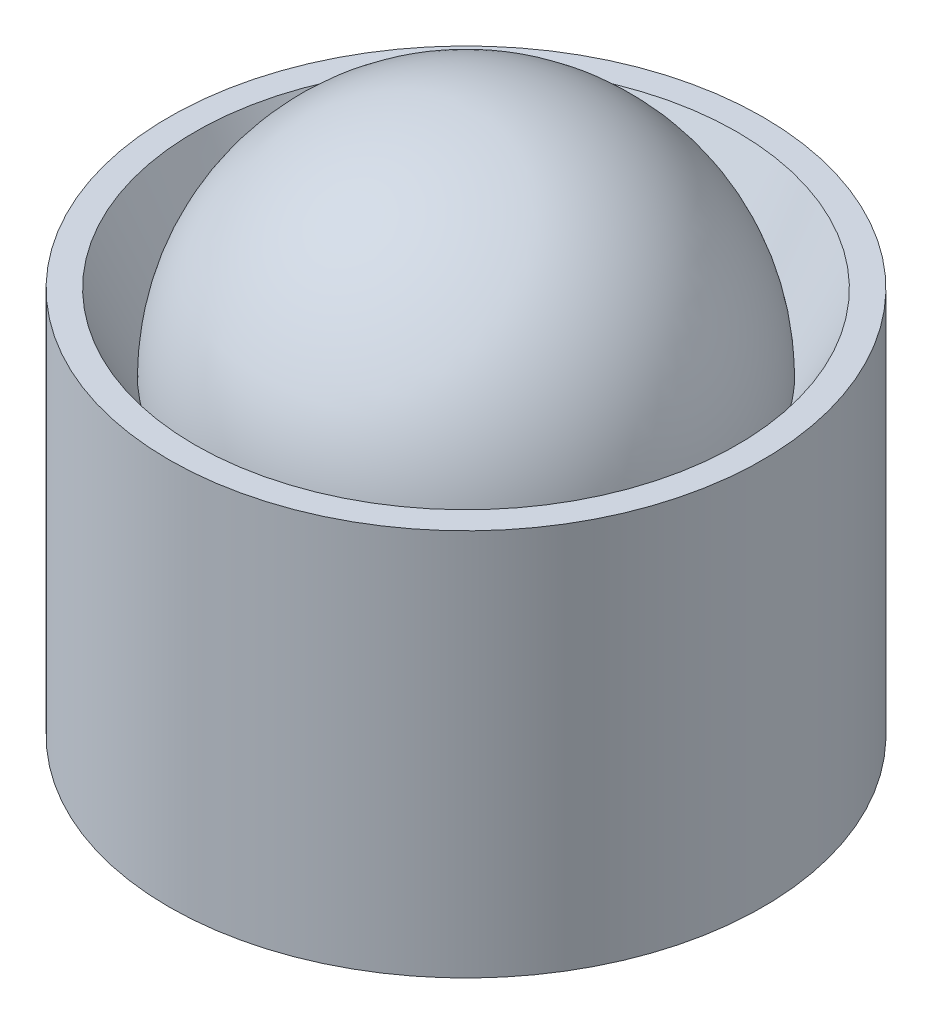
ISO-10303-21;
HEADER;
FILE_DESCRIPTION(('STEP AP214'),'2;1');
FILE_NAME('part.step','',(''),(''),'','','');
FILE_SCHEMA(('AUTOMOTIVE_DESIGN { 1 0 10303 214 1 1 1 1 }'));
ENDSEC;
DATA;
#1=APPLICATION_CONTEXT('core data for automotive mechanical design processes');
#2=APPLICATION_PROTOCOL_DEFINITION('international standard','automotive_design',2000,#1);
#3=PRODUCT_CONTEXT('',#1,'mechanical');
#4=PRODUCT('Part','Part','',(#3));
#5=PRODUCT_RELATED_PRODUCT_CATEGORY('part','',(#4));
#6=PRODUCT_DEFINITION_FORMATION('','',#4);
#7=PRODUCT_DEFINITION_CONTEXT('part definition',#1,'design');
#8=PRODUCT_DEFINITION('design','',#6,#7);
#9=PRODUCT_DEFINITION_SHAPE('','',#8);
#10=(LENGTH_UNIT() NAMED_UNIT(*) SI_UNIT(.MILLI.,.METRE.));
#11=(NAMED_UNIT(*) PLANE_ANGLE_UNIT() SI_UNIT($,.RADIAN.));
#12=(NAMED_UNIT(*) SI_UNIT($,.STERADIAN.) SOLID_ANGLE_UNIT());
#13=UNCERTAINTY_MEASURE_WITH_UNIT(LENGTH_MEASURE(1.E-05),#10,'distance_accuracy_value','');
#14=(GEOMETRIC_REPRESENTATION_CONTEXT(3) GLOBAL_UNCERTAINTY_ASSIGNED_CONTEXT((#13)) GLOBAL_UNIT_ASSIGNED_CONTEXT((#10,
#11,#12)) REPRESENTATION_CONTEXT('',''));
#15=CARTESIAN_POINT('',(0.,0.,0.));
#16=DIRECTION('',(0.,0.,1.));
#17=DIRECTION('',(1.,0.,0.));
#18=AXIS2_PLACEMENT_3D('',#15,#16,#17);
#19=CARTESIAN_POINT('',(0.,12.,0.));
#20=DIRECTION('',(0.,-1.,0.));
#21=DIRECTION('',(0.,0.,-1.));
#22=AXIS2_PLACEMENT_3D('',#19,#20,#21);
#23=SPHERICAL_SURFACE('',#22,9.);
#24=CARTESIAN_POINT('',(0.,12.,0.));
#25=DIRECTION('',(0.,1.,0.));
#26=DIRECTION('',(0.,0.,1.));
#27=AXIS2_PLACEMENT_3D('',#24,#25,#26);
#28=CIRCLE('',#27,9.);
#29=CARTESIAN_POINT('',(0.,12.,9.));
#30=VERTEX_POINT('',#29);
#31=EDGE_CURVE('E11',#30,#30,#28,.T.);
#32=ORIENTED_EDGE('',*,*,#31,.F.);
#33=EDGE_LOOP('',(#32));
#34=FACE_BOUND('',#33,.T.);
#35=ADVANCED_FACE('F46',(#34),#23,.T.);
#36=CARTESIAN_POINT('',(0.,12.,0.));
#37=DIRECTION('',(0.,-1.,0.));
#38=DIRECTION('',(0.,0.,-1.));
#39=AXIS2_PLACEMENT_3D('',#36,#37,#38);
#40=SPHERICAL_SURFACE('',#39,9.);
#41=ORIENTED_EDGE('',*,*,#31,.T.);
#42=EDGE_LOOP('',(#41));
#43=FACE_BOUND('',#42,.T.);
#44=ADVANCED_FACE('F53',(#43),#40,.T.);
#45=CLOSED_SHELL('',(#35,#44));
#46=MANIFOLD_SOLID_BREP('B2',#45);
#47=CARTESIAN_POINT('',(0.,15.,0.));
#48=DIRECTION('',(0.,1.,0.));
#49=DIRECTION('',(0.,0.,1.));
#50=AXIS2_PLACEMENT_3D('',#47,#48,#49);
#51=PLANE('',#50);
#52=CARTESIAN_POINT('',(0.,15.,0.));
#53=DIRECTION('',(0.,1.,0.));
#54=DIRECTION('',(0.,0.,1.));
#55=AXIS2_PLACEMENT_3D('',#52,#53,#54);
#56=CIRCLE('',#55,10.5);
#57=CARTESIAN_POINT('',(0.,15.,10.5));
#58=VERTEX_POINT('',#57);
#59=EDGE_CURVE('E45',#58,#58,#56,.F.);
#60=ORIENTED_EDGE('',*,*,#59,.T.);
#61=EDGE_LOOP('',(#60));
#62=FACE_BOUND('',#61,.T.);
#63=CARTESIAN_POINT('',(0.,15.,0.));
#64=DIRECTION('',(0.,1.,0.));
#65=DIRECTION('',(0.,0.,1.));
#66=AXIS2_PLACEMENT_3D('',#63,#64,#65);
#67=CIRCLE('',#66,11.5);
#68=CARTESIAN_POINT('',(0.,15.,11.5));
#69=VERTEX_POINT('',#68);
#70=EDGE_CURVE('E93',#69,#69,#67,.T.);
#71=ORIENTED_EDGE('',*,*,#70,.T.);
#72=EDGE_LOOP('',(#71));
#73=FACE_BOUND('',#72,.T.);
#74=ADVANCED_FACE('F74',(#62,#73),#51,.T.);
#75=CARTESIAN_POINT('',(0.,0.,0.));
#76=DIRECTION('',(0.,1.,0.));
#77=DIRECTION('',(0.,0.,1.));
#78=AXIS2_PLACEMENT_3D('',#75,#76,#77);
#79=PLANE('',#78);
#80=CARTESIAN_POINT('',(0.,0.,0.));
#81=DIRECTION('',(0.,1.,0.));
#82=DIRECTION('',(0.,0.,1.));
#83=AXIS2_PLACEMENT_3D('',#80,#81,#82);
#84=CIRCLE('',#83,11.5);
#85=CARTESIAN_POINT('',(0.,0.,11.5));
#86=VERTEX_POINT('',#85);
#87=EDGE_CURVE('E132',#86,#86,#84,.T.);
#88=ORIENTED_EDGE('',*,*,#87,.F.);
#89=EDGE_LOOP('',(#88));
#90=FACE_BOUND('',#89,.T.);
#91=CARTESIAN_POINT('',(0.,0.,0.));
#92=DIRECTION('',(0.,1.,0.));
#93=DIRECTION('',(0.,0.,1.));
#94=AXIS2_PLACEMENT_3D('',#91,#92,#93);
#95=CIRCLE('',#94,5.5);
#96=CARTESIAN_POINT('',(0.,0.,5.5));
#97=VERTEX_POINT('',#96);
#98=EDGE_CURVE('E133',#97,#97,#95,.T.);
#99=ORIENTED_EDGE('',*,*,#98,.T.);
#100=EDGE_LOOP('',(#99));
#101=FACE_BOUND('',#100,.T.);
#102=CARTESIAN_POINT('',(7.5,0.,0.));
#103=DIRECTION('',(0.,1.,0.));
#104=DIRECTION('',(0.,0.,1.));
#105=AXIS2_PLACEMENT_3D('',#102,#103,#104);
#106=CIRCLE('',#105,1.25);
#107=CARTESIAN_POINT('',(7.5,0.,1.25));
#108=VERTEX_POINT('',#107);
#109=EDGE_CURVE('E102',#108,#108,#106,.T.);
#110=ORIENTED_EDGE('',*,*,#109,.T.);
#111=EDGE_LOOP('',(#110));
#112=FACE_BOUND('',#111,.T.);
#113=CARTESIAN_POINT('',(-7.5,0.,0.));
#114=DIRECTION('',(0.,1.,0.));
#115=DIRECTION('',(0.,0.,1.));
#116=AXIS2_PLACEMENT_3D('',#113,#114,#115);
#117=CIRCLE('',#116,1.25);
#118=CARTESIAN_POINT('',(-7.5,0.,1.25));
#119=VERTEX_POINT('',#118);
#120=EDGE_CURVE('E103',#119,#119,#117,.T.);
#121=ORIENTED_EDGE('',*,*,#120,.T.);
#122=EDGE_LOOP('',(#121));
#123=FACE_BOUND('',#122,.T.);
#124=ADVANCED_FACE('F120',(#90,#101,#112,#123),#79,.F.);
#125=CARTESIAN_POINT('',(0.,15.,0.));
#126=DIRECTION('',(0.,-1.,0.));
#127=DIRECTION('',(0.,0.,-1.));
#128=AXIS2_PLACEMENT_3D('',#125,#126,#127);
#129=CYLINDRICAL_SURFACE('',#128,11.5);
#130=ORIENTED_EDGE('',*,*,#70,.F.);
#131=EDGE_LOOP('',(#130));
#132=FACE_BOUND('',#131,.T.);
#133=ORIENTED_EDGE('',*,*,#87,.T.);
#134=EDGE_LOOP('',(#133));
#135=FACE_BOUND('',#134,.T.);
#136=ADVANCED_FACE('F116',(#132,#135),#129,.T.);
#137=CARTESIAN_POINT('',(0.,15.,0.));
#138=DIRECTION('',(0.,-1.,0.));
#139=DIRECTION('',(0.,0.,-1.));
#140=AXIS2_PLACEMENT_3D('',#137,#138,#139);
#141=CYLINDRICAL_SURFACE('',#140,5.5);
#142=CARTESIAN_POINT('',(0.,4.99999999999992,0.));
#143=DIRECTION('',(0.,1.,0.));
#144=DIRECTION('',(0.,0.,1.));
#145=AXIS2_PLACEMENT_3D('',#142,#143,#144);
#146=CIRCLE('',#145,5.5);
#147=CARTESIAN_POINT('',(0.,4.99999999999992,5.5));
#148=VERTEX_POINT('',#147);
#149=EDGE_CURVE('E88',#148,#148,#146,.T.);
#150=ORIENTED_EDGE('',*,*,#149,.T.);
#151=EDGE_LOOP('',(#150));
#152=FACE_BOUND('',#151,.T.);
#153=ORIENTED_EDGE('',*,*,#98,.F.);
#154=EDGE_LOOP('',(#153));
#155=FACE_BOUND('',#154,.T.);
#156=ADVANCED_FACE('F112',(#152,#155),#141,.F.);
#157=CARTESIAN_POINT('',(7.5,15.,0.));
#158=DIRECTION('',(0.,-1.,0.));
#159=DIRECTION('',(0.,0.,-1.));
#160=AXIS2_PLACEMENT_3D('',#157,#158,#159);
#161=CYLINDRICAL_SURFACE('',#160,1.25);
#162=CARTESIAN_POINT('',(8.72447577444474,11.4561893455211,-0.251314698730399));
#163=CARTESIAN_POINT('',(8.71440263580107,11.438877730628,-0.300384123211562));
#164=CARTESIAN_POINT('',(8.70167075964813,11.4169710853546,-0.347349331222997));
#165=CARTESIAN_POINT('',(8.67234860744696,11.3663916627913,-0.436252777681186));
#166=CARTESIAN_POINT('',(8.65573842796392,11.337683971045,-0.478163333382276));
#167=CARTESIAN_POINT('',(8.61115344673935,11.2603974830546,-0.576184377917895));
#168=CARTESIAN_POINT('',(8.58158256066071,11.2089484655122,-0.629275510961483));
#169=CARTESIAN_POINT('',(8.5191547044853,11.0997745053494,-0.72604841959633));
#170=CARTESIAN_POINT('',(8.48629270555303,11.0420399463025,-0.769715463802317));
#171=CARTESIAN_POINT('',(8.42094347502713,10.9265979011231,-0.846596320893546));
#172=CARTESIAN_POINT('',(8.38858057207012,10.8691514454964,-0.880316654344363));
#173=CARTESIAN_POINT('',(8.32282611250835,10.75180633533,-0.942068366923311));
#174=CARTESIAN_POINT('',(8.28943369592984,10.691905616159,-0.970094832939257));
#175=CARTESIAN_POINT('',(8.22202355343383,10.5703082297452,-1.02126073126265));
#176=CARTESIAN_POINT('',(8.18800511860803,10.5086094735465,-1.04439419854246));
#177=CARTESIAN_POINT('',(8.11965030162447,10.3839223599722,-1.08634212973464));
#178=CARTESIAN_POINT('',(8.08531381015238,10.320933549467,-1.10515504670673));
#179=CARTESIAN_POINT('',(7.98556113259834,10.1368579777442,-1.15414393623877));
#180=CARTESIAN_POINT('',(7.91998863168483,10.0145091291008,-1.1793061074922));
#181=CARTESIAN_POINT('',(7.78926051987211,9.76771700832846,-1.21797685958728));
#182=CARTESIAN_POINT('',(7.72410534566984,9.64327192103844,-1.23147474883978));
#183=CARTESIAN_POINT('',(7.59444781487312,9.39261665314991,-1.24814699009076));
#184=CARTESIAN_POINT('',(7.52995004738093,9.2664008878614,-1.25127185164698));
#185=CARTESIAN_POINT('',(7.40232528245606,9.0135105971848,-1.24781065427379));
#186=CARTESIAN_POINT('',(7.33919757585701,8.88683635074654,-1.2412297470361));
#187=CARTESIAN_POINT('',(7.20957575661444,8.62338057075956,-1.21771730179126));
#188=CARTESIAN_POINT('',(7.14321714901552,8.48660237724743,-1.19999872760354));
#189=CARTESIAN_POINT('',(7.01267373321213,8.21369214779495,-1.15318631269216));
#190=CARTESIAN_POINT('',(6.94849170898421,8.07756111768652,-1.12407845964007));
#191=CARTESIAN_POINT('',(6.85452028518101,7.8753642393377,-1.07104169613973));
#192=CARTESIAN_POINT('',(6.82367929018923,7.80851851601315,-1.05187972521602));
#193=CARTESIAN_POINT('',(6.76277263010273,7.67555378828436,-1.01012944693287));
#194=CARTESIAN_POINT('',(6.73270679900456,7.60943463005405,-0.987541880425938));
#195=CARTESIAN_POINT('',(6.67353025113322,7.47835682716598,-0.93857329401892));
#196=CARTESIAN_POINT('',(6.64441769317257,7.4133960711095,-0.912200190280359));
#197=CARTESIAN_POINT('',(6.58727718326826,7.28498187840371,-0.855028428981015));
#198=CARTESIAN_POINT('',(6.55924855517785,7.2215275119417,-0.824232588709536));
#199=CARTESIAN_POINT('',(6.51745106490272,7.12623916783526,-0.773057231640536));
#200=CARTESIAN_POINT('',(6.5031831837764,7.0935874500796,-0.754602536625955));
#201=CARTESIAN_POINT('',(6.47510070549871,7.02908597169907,-0.715997330996718));
#202=CARTESIAN_POINT('',(6.46128618515045,6.99723634716589,-0.695846535088657));
#203=CARTESIAN_POINT('',(6.43422727073574,6.93462850491389,-0.653648328466713));
#204=CARTESIAN_POINT('',(6.42098213837826,6.90386888354629,-0.631603492205982));
#205=CARTESIAN_POINT('',(6.39518718707886,6.84375856146827,-0.585312111933238));
#206=CARTESIAN_POINT('',(6.38263704636775,6.81440720960846,-0.561066600752219));
#207=CARTESIAN_POINT('',(6.35628526113075,6.75257738404491,-0.505494946346142));
#208=CARTESIAN_POINT('',(6.34265443763029,6.72046303248287,-0.473674721832292));
#209=CARTESIAN_POINT('',(6.31715084303664,6.66017198102705,-0.40580732981778));
#210=CARTESIAN_POINT('',(6.30527623920092,6.63199117794233,-0.369764640196511));
#211=CARTESIAN_POINT('',(6.28707946682207,6.58868943354935,-0.303564739429978));
#212=CARTESIAN_POINT('',(6.28013061574425,6.57211373150107,-0.274545723108155));
#213=CARTESIAN_POINT('',(6.26808031847327,6.5433259840106,-0.214054721746737));
#214=CARTESIAN_POINT('',(6.26297538995188,6.5311057137311,-0.182587498368288));
#215=CARTESIAN_POINT('',(6.25582756486846,6.51398076849166,-0.123509702652293));
#216=CARTESIAN_POINT('',(6.25340037891475,6.50815874080202,-0.0962155493228931));
#217=CARTESIAN_POINT('',(6.25036544860808,6.50087761209433,-0.0409520836610587));
#218=CARTESIAN_POINT('',(6.24975635907694,6.4994152854097,-0.012983285940053));
#219=CARTESIAN_POINT('',(6.25042157026217,6.50101174135228,0.0428097069456129));
#220=CARTESIAN_POINT('',(6.2516966230484,6.50407232933561,0.0706338399168711));
#221=CARTESIAN_POINT('',(6.25599729828629,6.51438626741948,0.125351912374312));
#222=CARTESIAN_POINT('',(6.25902452283026,6.52164345466069,0.152244976659112));
#223=CARTESIAN_POINT('',(6.26788121150045,6.54284729793868,0.213663752884714));
#224=CARTESIAN_POINT('',(6.27431876112217,6.55824187202933,0.247596462559109));
#225=CARTESIAN_POINT('',(6.28920707747267,6.59375806116591,0.312397900849942));
#226=CARTESIAN_POINT('',(6.29766270232251,6.61389108144616,0.34325897707928));
#227=CARTESIAN_POINT('',(6.32245967071755,6.67276355687816,0.422677554928423));
#228=CARTESIAN_POINT('',(6.3401694674871,6.71464223468049,0.468447199115093));
#229=CARTESIAN_POINT('',(6.37808079060078,6.80378309120836,0.55312908843745));
#230=CARTESIAN_POINT('',(6.39828939926928,6.85106054117936,0.592021046545762));
#231=CARTESIAN_POINT('',(6.44189957850258,6.95247972281746,0.667036229489812));
#232=CARTESIAN_POINT('',(6.46542670164117,7.00687055647651,0.702744221806534));
#233=CARTESIAN_POINT('',(6.51383871167435,7.11805718731916,0.769204053593953));
#234=CARTESIAN_POINT('',(6.53872507519376,7.17485558436377,0.799950353544486));
#235=CARTESIAN_POINT('',(6.58957288685159,7.29013554468632,0.857376252465277));
#236=CARTESIAN_POINT('',(6.61553621559945,7.3486199927684,0.884048321072306));
#237=CARTESIAN_POINT('',(6.66831288231678,7.46670942408047,0.933869741728906));
#238=CARTESIAN_POINT('',(6.69512651863166,7.52631479755367,0.95701784043131));
#239=CARTESIAN_POINT('',(6.75169074054606,7.65121443089597,1.0019695097342));
#240=CARTESIAN_POINT('',(6.78150234288749,7.71657574265258,1.02350888493433));
#241=CARTESIAN_POINT('',(6.84185939273614,7.84795596513341,1.06332294554197));
#242=CARTESIAN_POINT('',(6.87240498371259,7.91397500291937,1.08159698670358));
#243=CARTESIAN_POINT('',(6.96506989588664,8.11282222541253,1.13194941172248));
#244=CARTESIAN_POINT('',(7.02817580928216,8.24634870973953,1.15952609474433));
#245=CARTESIAN_POINT('',(7.15664172930932,8.51435546738797,1.2038353954288));
#246=CARTESIAN_POINT('',(7.22200546722622,8.64883699609095,1.22054905973025));
#247=CARTESIAN_POINT('',(7.35451514933446,8.91773997832028,1.24332293618066));
#248=CARTESIAN_POINT('',(7.42166000501479,9.05216141971415,1.24938950955808));
#249=CARTESIAN_POINT('',(7.54361161007884,9.29307429186609,1.25040767389973));
#250=CARTESIAN_POINT('',(7.59815466052055,9.39969370928752,1.24736639825766));
#251=CARTESIAN_POINT('',(7.70793550033895,9.61209145786881,1.23382460863563));
#252=CARTESIAN_POINT('',(7.7631731462763,9.7178699555532,1.22332561066821));
#253=CARTESIAN_POINT('',(7.87380585675773,9.92762704749589,1.19416436903943));
#254=CARTESIAN_POINT('',(7.92919915225117,10.0316115229004,1.17553833674279));
#255=CARTESIAN_POINT('',(8.03991201310242,10.2374656200297,1.1289840744657));
#256=CARTESIAN_POINT('',(8.09523160077375,10.3393369947327,1.10106391173898));
#257=CARTESIAN_POINT('',(8.19139909086399,10.5148301992661,1.04249421172484));
#258=CARTESIAN_POINT('',(8.23241556770312,10.5891614324524,1.0142617270957));
#259=CARTESIAN_POINT('',(8.31359523636179,10.7353235064098,0.950388525413464));
#260=CARTESIAN_POINT('',(8.3537568119537,10.8071497511497,0.914734949732726));
#261=CARTESIAN_POINT('',(8.43265826053745,10.9474026690592,0.834185177197009));
#262=CARTESIAN_POINT('',(8.47138217301853,11.015793120513,0.789209037541732));
#263=CARTESIAN_POINT('',(8.5454292344012,11.1458428070968,0.688110073032632));
#264=CARTESIAN_POINT('',(8.58076432537825,11.2075257903511,0.632028699111522));
#265=CARTESIAN_POINT('',(8.62951482470249,11.2922451099337,0.536669541944438));
#266=CARTESIAN_POINT('',(8.64526364726148,11.3195398060973,0.502390894064477));
#267=CARTESIAN_POINT('',(8.67440429717407,11.3699420770906,0.429886226576121));
#268=CARTESIAN_POINT('',(8.68779578005731,11.3930490399952,0.39165963135986));
#269=CARTESIAN_POINT('',(8.71149022403933,11.4338704425381,0.31078387445994));
#270=CARTESIAN_POINT('',(8.72175054134046,11.4515104734534,0.268083450620344));
#271=CARTESIAN_POINT('',(8.73785826848365,11.4791788575924,0.179492872752793));
#272=CARTESIAN_POINT('',(8.74371489216363,11.4892231037134,0.133609599284161));
#273=CARTESIAN_POINT('',(8.74980358557388,11.4996639587908,0.0463919755991557));
#274=CARTESIAN_POINT('',(8.75066117644181,11.5011335302907,0.00522979735742122));
#275=CARTESIAN_POINT('',(8.74831940183195,11.4971188459679,-0.0766166105958425));
#276=CARTESIAN_POINT('',(8.74512389807365,11.4916412093271,-0.117301258035951));
#277=CARTESIAN_POINT('',(8.73806717571861,11.4795320616453,-0.173076723720084));
#278=CARTESIAN_POINT('',(8.73573297195983,11.4755256845191,-0.188994396467551));
#279=CARTESIAN_POINT('',(8.73051054342521,11.4665581377769,-0.220447814765188));
#280=CARTESIAN_POINT('',(8.72762292166126,11.4615980073644,-0.235983955440256));
#281=CARTESIAN_POINT('',(8.72447577444474,11.4561893455211,-0.251314698730399));
#282=B_SPLINE_CURVE_WITH_KNOTS('',3,(#162,#163,#164,#165,#166,#167,#168,#169,#170,#171,#172,
#173,#174,#175,#176,#177,#178,#179,#180,#181,#182,#183,#184,#185,#186,#187,#188,#189,#190,#191,
#192,#193,#194,#195,#196,#197,#198,#199,#200,#201,#202,#203,#204,#205,#206,#207,#208,#209,#210,
#211,#212,#213,#214,#215,#216,#217,#218,#219,#220,#221,#222,#223,#224,#225,#226,#227,#228,#229,
#230,#231,#232,#233,#234,#235,#236,#237,#238,#239,#240,#241,#242,#243,#244,#245,#246,#247,#248,
#249,#250,#251,#252,#253,#254,#255,#256,#257,#258,#259,#260,#261,#262,#263,#264,#265,#266,#267,
#268,#269,#270,#271,#272,#273,#274,#275,#276,#277,#278,#279,#280,#281),.UNSPECIFIED.,.T.,.F.,(4,
2,2,2,2,2,2,2,2,2,2,2,2,2,2,2,2,2,2,2,2,2,2,2,2,2,2,2,2,2,2,2,2,2,2,2,2,2,2,2,2,2,2,2,2,2,2,2,2,
2,2,2,2,2,2,2,2,2,2,4),(0.,0.158925481438663,0.318685225981454,0.556216981904373,
0.794117391619943,1.01596550231328,1.23800423530494,1.46031211390116,1.6826994644869,
2.10525607217915,2.52819958959474,2.95315812188495,3.37789117305668,3.83665328334751,
4.29598159638871,4.52412682414251,4.75222278117487,4.97984852043901,5.2073298996863,
5.32767819250951,5.44804676918037,5.56825424902329,5.6884056013992,5.82979185177035,
5.9710294981569,6.07311471686331,6.17500612253125,6.2586793627133,6.34229067914455,
6.42593537869077,6.50965667957353,6.62245478432508,6.73552721706974,6.92798658181106,
7.12100450149658,7.32824620293734,7.53571770373701,7.74356814930104,7.9514923478191,
8.17639731924776,8.40134661523806,8.85156137290471,9.30255955348056,9.75328818809506,
10.1124777837145,10.4715943838362,10.829126963707,11.1863500129851,11.4544880151416,
11.7230945501816,11.994107526312,12.2641273768083,12.4034959883978,12.5428849485931,
12.6840952854735,12.8250093398026,12.9478339967315,13.0705417162799,13.1202486058964,
13.1699016390012),.UNSPECIFIED.);
#283=CARTESIAN_POINT('',(8.72447577444474,11.4561893455211,-0.251314698730399));
#284=VERTEX_POINT('',#283);
#285=EDGE_CURVE('E80',#284,#284,#282,.T.);
#286=ORIENTED_EDGE('',*,*,#285,.T.);
#287=EDGE_LOOP('',(#286));
#288=FACE_BOUND('',#287,.T.);
#289=ORIENTED_EDGE('',*,*,#109,.F.);
#290=EDGE_LOOP('',(#289));
#291=FACE_BOUND('',#290,.T.);
#292=ADVANCED_FACE('F107',(#288,#291),#161,.F.);
#293=CARTESIAN_POINT('',(-7.5,15.,0.));
#294=DIRECTION('',(0.,-1.,0.));
#295=DIRECTION('',(0.,0.,-1.));
#296=AXIS2_PLACEMENT_3D('',#293,#294,#295);
#297=CYLINDRICAL_SURFACE('',#296,1.25);
#298=CARTESIAN_POINT('',(-8.72447577444474,11.4561893455211,-0.251314698730399));
#299=CARTESIAN_POINT('',(-8.73204363488598,11.4691954392119,-0.214432303596094));
#300=CARTESIAN_POINT('',(-8.73812703059132,11.4796359755695,-0.176288990905353));
#301=CARTESIAN_POINT('',(-8.74673214398301,11.4943986922023,-0.0984379389065299));
#302=CARTESIAN_POINT('',(-8.74925526935533,11.4987232906438,-0.0587308242928231));
#303=CARTESIAN_POINT('',(-8.75046028100662,11.5007890780376,0.0210191641880927));
#304=CARTESIAN_POINT('',(-8.74913286194739,11.4985143187879,0.0610626178567545));
#305=CARTESIAN_POINT('',(-8.74277153405398,11.4876047502665,0.139965959777105));
#306=CARTESIAN_POINT('',(-8.73773481360244,11.478965116475,0.178824926917763));
#307=CARTESIAN_POINT('',(-8.72353444054596,11.4545762477731,0.259561728368457));
#308=CARTESIAN_POINT('',(-8.71389177379097,11.4380010687739,0.301100674320794));
#309=CARTESIAN_POINT('',(-8.69139464774036,11.3992544285276,0.380513037343226));
#310=CARTESIAN_POINT('',(-8.67853523431262,11.3770743345724,0.418380674214636));
#311=CARTESIAN_POINT('',(-8.643188233585,11.3159648010664,0.508983681581859));
#312=CARTESIAN_POINT('',(-8.61916377282171,11.2743107048973,0.559259535524155));
#313=CARTESIAN_POINT('',(-8.567797205628,11.1848726499323,0.652021489652621));
#314=CARTESIAN_POINT('',(-8.54044678683415,11.1370733149409,0.694487377425207));
#315=CARTESIAN_POINT('',(-8.48641440876057,11.0422093701269,0.769020769082814));
#316=CARTESIAN_POINT('',(-8.45991603304319,10.9955068106765,0.801692993100078));
#317=CARTESIAN_POINT('',(-8.40581110959269,10.8997326352066,0.862356956084354));
#318=CARTESIAN_POINT('',(-8.37820367353542,10.8506591134741,0.890344846463809));
#319=CARTESIAN_POINT('',(-8.32224553359786,10.750738251248,0.942268722894763));
#320=CARTESIAN_POINT('',(-8.29389388392419,10.6998886234594,0.966199232922855));
#321=CARTESIAN_POINT('',(-8.23673269936256,10.5968858448098,1.01046013616817));
#322=CARTESIAN_POINT('',(-8.20792299619187,10.5447322106475,1.03078917131298));
#323=CARTESIAN_POINT('',(-8.12279104259712,10.3898714471199,1.08587489201143));
#324=CARTESIAN_POINT('',(-8.06609516204783,10.2857838558868,1.11620235373501));
#325=CARTESIAN_POINT('',(-7.95254631199198,10.0752571801841,1.16685908479694));
#326=CARTESIAN_POINT('',(-7.89569324620251,9.9688160306859,1.18717917780709));
#327=CARTESIAN_POINT('',(-7.78220517701428,9.75416949797082,1.21915698856976));
#328=CARTESIAN_POINT('',(-7.72557117776549,9.64596012518952,1.23079115436413));
#329=CARTESIAN_POINT('',(-7.61300595581952,9.42861559143679,1.24617584651713));
#330=CARTESIAN_POINT('',(-7.55707489247939,9.31948022961087,1.24992461617947));
#331=CARTESIAN_POINT('',(-7.42671342542446,9.06235740331717,1.25009935772854));
#332=CARTESIAN_POINT('',(-7.35267224108996,8.91416338903796,1.24349714618851));
#333=CARTESIAN_POINT('',(-7.20675187705024,8.61769896686844,1.2173752384381));
#334=CARTESIAN_POINT('',(-7.1348748288846,8.46942862111588,1.19784321598562));
#335=CARTESIAN_POINT('',(-6.99389072392028,8.174102349913,1.14543450920581));
#336=CARTESIAN_POINT('',(-6.92478002211844,8.02704504370444,1.11257606574079));
#337=CARTESIAN_POINT('',(-6.82368652513214,7.80856642784323,1.05196461493273));
#338=CARTESIAN_POINT('',(-6.790436445443,7.73613385827808,1.02988997230273));
#339=CARTESIAN_POINT('',(-6.72490378292507,7.59225481331259,0.981523799544976));
#340=CARTESIAN_POINT('',(-6.692620872227,7.52080800827326,0.955233718091728));
#341=CARTESIAN_POINT('',(-6.63688803563475,7.39649795313022,0.904757717977538));
#342=CARTESIAN_POINT('',(-6.6131928030379,7.34332560106229,0.881604837281202));
#343=CARTESIAN_POINT('',(-6.56657521220408,7.23809952653121,0.832091613553858));
#344=CARTESIAN_POINT('',(-6.54365318856571,7.18604629180072,0.805729904109168));
#345=CARTESIAN_POINT('',(-6.49891331481295,7.08386007444389,0.749408076160498));
#346=CARTESIAN_POINT('',(-6.47708990501375,7.03371782085525,0.719469374284129));
#347=CARTESIAN_POINT('',(-6.434729036113,6.93584653743778,0.655121421816718));
#348=CARTESIAN_POINT('',(-6.41419000556261,6.88811457293893,0.620717799212878));
#349=CARTESIAN_POINT('',(-6.38139328307581,6.81150057442062,0.558579542507299));
#350=CARTESIAN_POINT('',(-6.36863723222343,6.78159075405254,0.532383948893197));
#351=CARTESIAN_POINT('',(-6.34418793823237,6.72407568395292,0.476987788716597));
#352=CARTESIAN_POINT('',(-6.33249630460247,6.69647392922781,0.447782809267946));
#353=CARTESIAN_POINT('',(-6.31050607916178,6.64440778588644,0.385621282831616));
#354=CARTESIAN_POINT('',(-6.30022265724151,6.61997769055438,0.352630003874372));
#355=CARTESIAN_POINT('',(-6.28188063671459,6.57629971825491,0.282803370796303));
#356=CARTESIAN_POINT('',(-6.27381591345564,6.55703757901869,0.245978993699452));
#357=CARTESIAN_POINT('',(-6.26288147942387,6.5308820070526,0.180979957081228));
#358=CARTESIAN_POINT('',(-6.25917542592557,6.52200344434296,0.153753681743234));
#359=CARTESIAN_POINT('',(-6.25354193551235,6.5084996142987,0.0980896895560503));
#360=CARTESIAN_POINT('',(-6.25161230389153,6.50386909867804,0.0696535130856336));
#361=CARTESIAN_POINT('',(-6.24972809935542,6.49934766232345,0.0122013984501855));
#362=CARTESIAN_POINT('',(-6.24978237966937,6.49947798689091,-0.0168165608065606));
#363=CARTESIAN_POINT('',(-6.25188096456085,6.5045137205505,-0.0743643438415426));
#364=CARTESIAN_POINT('',(-6.25392663696317,6.50942241175283,-0.102893818388396));
#365=CARTESIAN_POINT('',(-6.26031358041639,6.52473080212223,-0.163607760974874));
#366=CARTESIAN_POINT('',(-6.26499682829035,6.53594801561146,-0.195546408831559));
#367=CARTESIAN_POINT('',(-6.27630911052852,6.56299046107541,-0.257027930087712));
#368=CARTESIAN_POINT('',(-6.28294185262797,6.57882447325895,-0.286566100113491));
#369=CARTESIAN_POINT('',(-6.30196876148975,6.62413906366974,-0.359684476478618));
#370=CARTESIAN_POINT('',(-6.31546309485898,6.65618316881749,-0.401366708991506));
#371=CARTESIAN_POINT('',(-6.34475970251137,6.72543883895053,-0.479225517186521));
#372=CARTESIAN_POINT('',(-6.36056844013392,6.76266486045151,-0.51538607524149));
#373=CARTESIAN_POINT('',(-6.39398489038196,6.84097550724604,-0.583690573856362));
#374=CARTESIAN_POINT('',(-6.41161692613344,6.8821114870406,-0.615762635537771));
#375=CARTESIAN_POINT('',(-6.44803135831137,6.96663691868561,-0.676094373841224));
#376=CARTESIAN_POINT('',(-6.46681492956029,7.01002866482316,-0.704350059537651));
#377=CARTESIAN_POINT('',(-6.50528060632017,7.0984271361596,-0.757704482965547));
#378=CARTESIAN_POINT('',(-6.52496420817858,7.14343652206696,-0.782797682026892));
#379=CARTESIAN_POINT('',(-6.56503507828241,7.23458300881509,-0.830242079869448));
#380=CARTESIAN_POINT('',(-6.58542261031142,7.28072053046982,-0.852592236143232));
#381=CARTESIAN_POINT('',(-6.65307245279568,7.43300016649401,-0.921820686558099));
#382=CARTESIAN_POINT('',(-6.70155027786592,7.54085851736073,-0.963759214533218));
#383=CARTESIAN_POINT('',(-6.80075171042217,7.75888944294752,-1.03796519768264));
#384=CARTESIAN_POINT('',(-6.85147779972414,7.86906450081472,-1.07022164363896));
#385=CARTESIAN_POINT('',(-6.95486451628226,8.09092616378337,-1.12640789796745));
#386=CARTESIAN_POINT('',(-7.00752921732482,8.20261559892129,-1.15031891790267));
#387=CARTESIAN_POINT('',(-7.11441983506601,8.42663318941646,-1.19041313341346));
#388=CARTESIAN_POINT('',(-7.16864596676398,8.53896143100802,-1.2065952593209));
#389=CARTESIAN_POINT('',(-7.28559423887616,8.77842313224862,-1.23311790852599));
#390=CARTESIAN_POINT('',(-7.34850358738733,8.90558073531321,-1.242424020364));
#391=CARTESIAN_POINT('',(-7.47578100831102,9.15958434718587,-1.25139315361247));
#392=CARTESIAN_POINT('',(-7.54014973124776,9.28643018794599,-1.25105178667029));
#393=CARTESIAN_POINT('',(-7.66969567100328,9.53858317079658,-1.24012564108541));
#394=CARTESIAN_POINT('',(-7.73486813791459,9.66389461071936,-1.22958553956055));
#395=CARTESIAN_POINT('',(-7.86579326158002,9.91266897664462,-1.19718306753024));
#396=CARTESIAN_POINT('',(-7.93154536131031,10.0361334228879,-1.17533060325883));
#397=CARTESIAN_POINT('',(-8.04792901092674,10.25221881067,-1.12486510172616));
#398=CARTESIAN_POINT('',(-8.09858727651057,10.3454492491616,-1.0989325043826));
#399=CARTESIAN_POINT('',(-8.19938455420793,10.529413786575,-1.0377165483545));
#400=CARTESIAN_POINT('',(-8.24952258245757,10.6201435569498,-1.00241797775711));
#401=CARTESIAN_POINT('',(-8.32374284322109,10.7534050847502,-0.940738595128765));
#402=CARTESIAN_POINT('',(-8.34843826195905,10.7975649222655,-0.918591820972105));
#403=CARTESIAN_POINT('',(-8.39720350415895,10.8844334141284,-0.871026804078215));
#404=CARTESIAN_POINT('',(-8.42127360246403,10.9271427086504,-0.845610028856482));
#405=CARTESIAN_POINT('',(-8.46847892782821,11.0105988726611,-0.791104783194936));
#406=CARTESIAN_POINT('',(-8.49161558267002,11.0513487590907,-0.762022224577714));
#407=CARTESIAN_POINT('',(-8.53656244564133,11.130245167918,-0.699652804053288));
#408=CARTESIAN_POINT('',(-8.55837403667466,11.1683944097434,-0.666370440958667));
#409=CARTESIAN_POINT('',(-8.6007701051888,11.2423204669301,-0.593827412309697));
#410=CARTESIAN_POINT('',(-8.62129119180766,11.2779790189556,-0.554406928843621));
#411=CARTESIAN_POINT('',(-8.65922034099611,11.3437104826958,-0.46993054678724));
#412=CARTESIAN_POINT('',(-8.67664118891293,11.3738063556582,-0.424899159749517));
#413=CARTESIAN_POINT('',(-8.69810769269661,11.4108179824727,-0.357038306895375));
#414=CARTESIAN_POINT('',(-8.70403011939367,11.4210188131555,-0.336569970931718));
#415=CARTESIAN_POINT('',(-8.71496869095163,11.4398454509184,-0.294654837154486));
#416=CARTESIAN_POINT('',(-8.71998373784046,11.4484693499699,-0.27320689273734));
#417=CARTESIAN_POINT('',(-8.72447577444474,11.4561893455211,-0.251314698730399));
#418=B_SPLINE_CURVE_WITH_KNOTS('',3,(#298,#299,#300,#301,#302,#303,#304,#305,#306,#307,#308,
#309,#310,#311,#312,#313,#314,#315,#316,#317,#318,#319,#320,#321,#322,#323,#324,#325,#326,#327,
#328,#329,#330,#331,#332,#333,#334,#335,#336,#337,#338,#339,#340,#341,#342,#343,#344,#345,#346,
#347,#348,#349,#350,#351,#352,#353,#354,#355,#356,#357,#358,#359,#360,#361,#362,#363,#364,#365,
#366,#367,#368,#369,#370,#371,#372,#373,#374,#375,#376,#377,#378,#379,#380,#381,#382,#383,#384,
#385,#386,#387,#388,#389,#390,#391,#392,#393,#394,#395,#396,#397,#398,#399,#400,#401,#402,#403,
#404,#405,#406,#407,#408,#409,#410,#411,#412,#413,#414,#415,#416,#417),.UNSPECIFIED.,.T.,.F.,(4,
2,2,2,2,2,2,2,2,2,2,2,2,2,2,2,2,2,2,2,2,2,2,2,2,2,2,2,2,2,2,2,2,2,2,2,2,2,2,2,2,2,2,2,2,2,2,2,2,
2,2,2,2,2,2,2,2,2,2,4),(0.,0.119412994309049,0.238778760983964,0.358433230595761,
0.478178490699141,0.614686472644879,0.751405999926789,0.958947402692783,1.1670185937607,
1.35531155217365,1.54375845821681,1.73245771034969,1.92122796791778,2.28766801087473,
2.6544434409181,3.02220980899785,3.39005809882438,3.88687438386963,4.38416497699951,
4.88077717652167,5.12878873486197,5.37671524369572,5.56458304035831,5.75253111837621,
5.93940552067094,6.12604661684795,6.25117475236596,6.37648905662873,6.50306191798753,
6.62928179041774,6.71557685523992,6.80176516194459,6.88833813169691,6.97497060769577,
7.07692296212943,7.17907048808696,7.3409935526869,7.50337775803573,7.66830839346287,
7.83341018922072,7.99879723487129,8.16424694333792,8.54003277804703,8.91624430332243,
9.29329742852258,9.67040272223781,10.0965889257725,10.5229689919199,10.9474896517515,
11.3716391862079,11.6990052783537,12.0269063576258,12.1925052707329,12.3580301236959,
12.5232913699682,12.6883770684355,12.8588574187537,13.0286175397657,13.0994121217098,
13.1702918037056),.UNSPECIFIED.);
#419=CARTESIAN_POINT('',(-8.72447577444474,11.4561893455211,-0.251314698730399));
#420=VERTEX_POINT('',#419);
#421=EDGE_CURVE('E96',#420,#420,#418,.T.);
#422=ORIENTED_EDGE('',*,*,#421,.T.);
#423=EDGE_LOOP('',(#422));
#424=FACE_BOUND('',#423,.T.);
#425=ORIENTED_EDGE('',*,*,#120,.F.);
#426=EDGE_LOOP('',(#425));
#427=FACE_BOUND('',#426,.T.);
#428=ADVANCED_FACE('F104',(#424,#427),#297,.F.);
#429=CARTESIAN_POINT('',(0.,4.99999999999992,0.));
#430=DIRECTION('',(0.,1.,0.));
#431=DIRECTION('',(0.,0.,1.));
#432=AXIS2_PLACEMENT_3D('',#429,#430,#431);
#433=CONICAL_SURFACE('',#432,5.5,0.463647609000804);
#434=ORIENTED_EDGE('',*,*,#59,.F.);
#435=EDGE_LOOP('',(#434));
#436=FACE_BOUND('',#435,.T.);
#437=ORIENTED_EDGE('',*,*,#149,.F.);
#438=EDGE_LOOP('',(#437));
#439=FACE_BOUND('',#438,.T.);
#440=ORIENTED_EDGE('',*,*,#421,.F.);
#441=EDGE_LOOP('',(#440));
#442=FACE_BOUND('',#441,.T.);
#443=ORIENTED_EDGE('',*,*,#285,.F.);
#444=EDGE_LOOP('',(#443));
#445=FACE_BOUND('',#444,.T.);
#446=ADVANCED_FACE('F77',(#436,#439,#442,#445),#433,.F.);
#447=CLOSED_SHELL('',(#74,#124,#136,#156,#292,#428,#446));
#448=MANIFOLD_SOLID_BREP('B6',#447);
#449=ADVANCED_BREP_SHAPE_REPRESENTATION('',(#18,#46,#448),#14);
#450=SHAPE_DEFINITION_REPRESENTATION(#9,#449);
ENDSEC;
END-ISO-10303-21;
